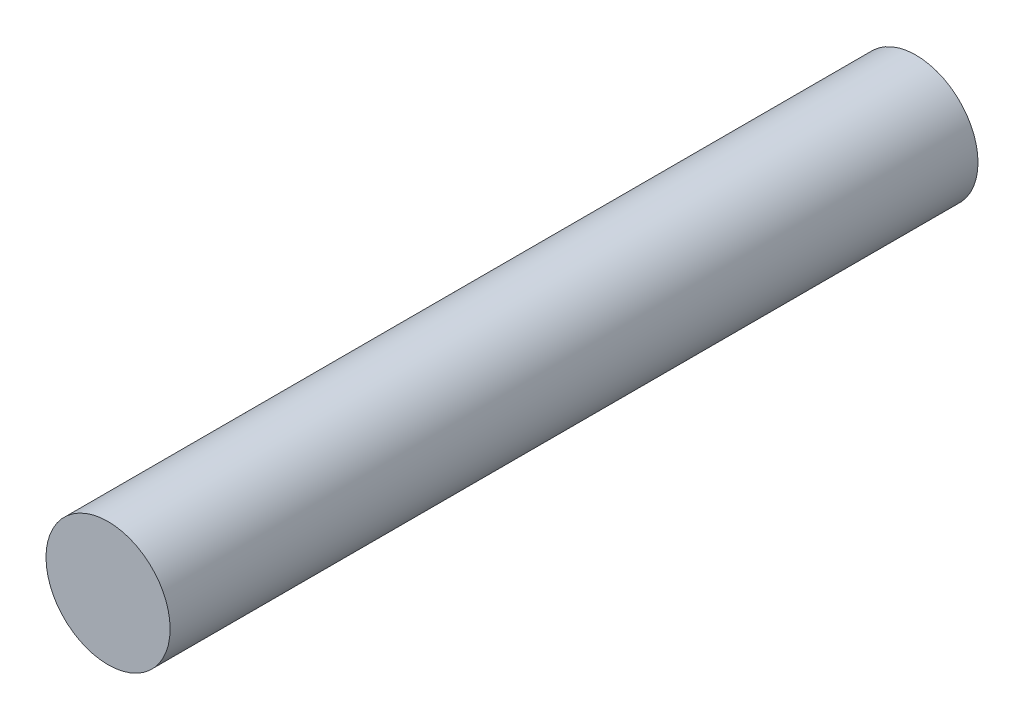
ISO-10303-21;
HEADER;
FILE_DESCRIPTION(('STEP AP214'),'2;1');
FILE_NAME('part.step','',(''),(''),'','','');
FILE_SCHEMA(('AUTOMOTIVE_DESIGN { 1 0 10303 214 1 1 1 1 }'));
ENDSEC;
DATA;
#1=APPLICATION_CONTEXT('core data for automotive mechanical design processes');
#2=APPLICATION_PROTOCOL_DEFINITION('international standard','automotive_design',2000,#1);
#3=PRODUCT_CONTEXT('',#1,'mechanical');
#4=PRODUCT('Part','Part','',(#3));
#5=PRODUCT_RELATED_PRODUCT_CATEGORY('part','',(#4));
#6=PRODUCT_DEFINITION_FORMATION('','',#4);
#7=PRODUCT_DEFINITION_CONTEXT('part definition',#1,'design');
#8=PRODUCT_DEFINITION('design','',#6,#7);
#9=PRODUCT_DEFINITION_SHAPE('','',#8);
#10=(LENGTH_UNIT() NAMED_UNIT(*) SI_UNIT(.MILLI.,.METRE.));
#11=(NAMED_UNIT(*) PLANE_ANGLE_UNIT() SI_UNIT($,.RADIAN.));
#12=(NAMED_UNIT(*) SI_UNIT($,.STERADIAN.) SOLID_ANGLE_UNIT());
#13=UNCERTAINTY_MEASURE_WITH_UNIT(LENGTH_MEASURE(1.E-05),#10,'distance_accuracy_value','');
#14=(GEOMETRIC_REPRESENTATION_CONTEXT(3) GLOBAL_UNCERTAINTY_ASSIGNED_CONTEXT((#13)) GLOBAL_UNIT_ASSIGNED_CONTEXT((#10,
#11,#12)) REPRESENTATION_CONTEXT('',''));
#15=CARTESIAN_POINT('',(0.,0.,0.));
#16=DIRECTION('',(0.,0.,1.));
#17=DIRECTION('',(1.,0.,0.));
#18=AXIS2_PLACEMENT_3D('',#15,#16,#17);
#19=CARTESIAN_POINT('',(0.,0.,14.3200034916197));
#20=DIRECTION('',(0.,0.,1.));
#21=DIRECTION('',(1.,0.,0.));
#22=AXIS2_PLACEMENT_3D('',#19,#20,#21);
#23=PLANE('',#22);
#24=CARTESIAN_POINT('',(0.,0.,14.3200034916197));
#25=DIRECTION('',(0.,0.,-1.));
#26=DIRECTION('',(-1.,0.,0.));
#27=AXIS2_PLACEMENT_3D('',#24,#25,#26);
#28=CIRCLE('',#27,2.2);
#29=CARTESIAN_POINT('',(-2.2,0.,14.3200034916197));
#30=VERTEX_POINT('',#29);
#31=EDGE_CURVE('E9',#30,#30,#28,.T.);
#32=ORIENTED_EDGE('',*,*,#31,.F.);
#33=EDGE_LOOP('',(#32));
#34=FACE_BOUND('',#33,.T.);
#35=ADVANCED_FACE('F14',(#34),#23,.T.);
#36=CARTESIAN_POINT('',(0.,0.,-14.3200034916197));
#37=DIRECTION('',(0.,0.,-1.));
#38=DIRECTION('',(-1.,0.,0.));
#39=AXIS2_PLACEMENT_3D('',#36,#37,#38);
#40=PLANE('',#39);
#41=CARTESIAN_POINT('',(0.,0.,-14.3200034916197));
#42=DIRECTION('',(0.,0.,1.));
#43=DIRECTION('',(1.,0.,0.));
#44=AXIS2_PLACEMENT_3D('',#41,#42,#43);
#45=CIRCLE('',#44,2.2);
#46=CARTESIAN_POINT('',(2.2,0.,-14.3200034916197));
#47=VERTEX_POINT('',#46);
#48=EDGE_CURVE('E21',#47,#47,#45,.T.);
#49=ORIENTED_EDGE('',*,*,#48,.F.);
#50=EDGE_LOOP('',(#49));
#51=FACE_BOUND('',#50,.T.);
#52=ADVANCED_FACE('F29',(#51),#40,.T.);
#53=CARTESIAN_POINT('',(0.,0.,-14.3200034916197));
#54=DIRECTION('',(0.,0.,1.));
#55=DIRECTION('',(1.,0.,0.));
#56=AXIS2_PLACEMENT_3D('',#53,#54,#55);
#57=CYLINDRICAL_SURFACE('',#56,2.2);
#58=ORIENTED_EDGE('',*,*,#31,.T.);
#59=EDGE_LOOP('',(#58));
#60=FACE_BOUND('',#59,.T.);
#61=ORIENTED_EDGE('',*,*,#48,.T.);
#62=EDGE_LOOP('',(#61));
#63=FACE_BOUND('',#62,.T.);
#64=ADVANCED_FACE('F16',(#60,#63),#57,.T.);
#65=CLOSED_SHELL('',(#35,#52,#64));
#66=MANIFOLD_SOLID_BREP('B1',#65);
#67=ADVANCED_BREP_SHAPE_REPRESENTATION('',(#18,#66),#14);
#68=SHAPE_DEFINITION_REPRESENTATION(#9,#67);
ENDSEC;
END-ISO-10303-21;
